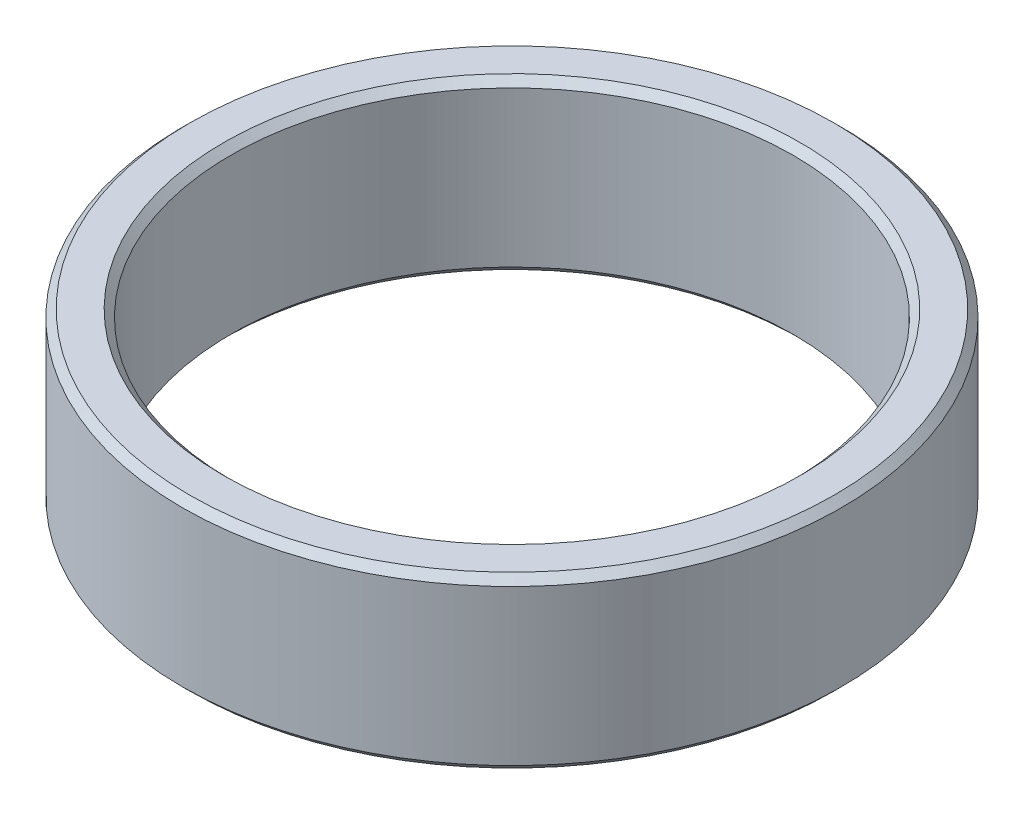
ISO-10303-21;
HEADER;
FILE_DESCRIPTION(('STEP AP214'),'2;1');
FILE_NAME('part.step','',(''),(''),'','','');
FILE_SCHEMA(('AUTOMOTIVE_DESIGN { 1 0 10303 214 1 1 1 1 }'));
ENDSEC;
DATA;
#1=APPLICATION_CONTEXT('core data for automotive mechanical design processes');
#2=APPLICATION_PROTOCOL_DEFINITION('international standard','automotive_design',2000,#1);
#3=PRODUCT_CONTEXT('',#1,'mechanical');
#4=PRODUCT('Part','Part','',(#3));
#5=PRODUCT_RELATED_PRODUCT_CATEGORY('part','',(#4));
#6=PRODUCT_DEFINITION_FORMATION('','',#4);
#7=PRODUCT_DEFINITION_CONTEXT('part definition',#1,'design');
#8=PRODUCT_DEFINITION('design','',#6,#7);
#9=PRODUCT_DEFINITION_SHAPE('','',#8);
#10=(LENGTH_UNIT() NAMED_UNIT(*) SI_UNIT(.MILLI.,.METRE.));
#11=(NAMED_UNIT(*) PLANE_ANGLE_UNIT() SI_UNIT($,.RADIAN.));
#12=(NAMED_UNIT(*) SI_UNIT($,.STERADIAN.) SOLID_ANGLE_UNIT());
#13=UNCERTAINTY_MEASURE_WITH_UNIT(LENGTH_MEASURE(1.E-05),#10,'distance_accuracy_value','');
#14=(GEOMETRIC_REPRESENTATION_CONTEXT(3) GLOBAL_UNCERTAINTY_ASSIGNED_CONTEXT((#13)) GLOBAL_UNIT_ASSIGNED_CONTEXT((#10,
#11,#12)) REPRESENTATION_CONTEXT('',''));
#15=CARTESIAN_POINT('',(0.,0.,0.));
#16=DIRECTION('',(0.,0.,1.));
#17=DIRECTION('',(1.,0.,0.));
#18=AXIS2_PLACEMENT_3D('',#15,#16,#17);
#19=CARTESIAN_POINT('',(0.,7.,0.));
#20=DIRECTION('',(0.,1.,0.));
#21=DIRECTION('',(0.,0.,1.));
#22=AXIS2_PLACEMENT_3D('',#19,#20,#21);
#23=PLANE('',#22);
#24=CARTESIAN_POINT('',(0.,7.,0.));
#25=DIRECTION('',(0.,1.,0.));
#26=DIRECTION('',(0.,0.,1.));
#27=AXIS2_PLACEMENT_3D('',#24,#25,#26);
#28=CIRCLE('',#27,11.9);
#29=CARTESIAN_POINT('',(0.,7.,11.9));
#30=VERTEX_POINT('',#29);
#31=EDGE_CURVE('E10',#30,#30,#28,.F.);
#32=ORIENTED_EDGE('',*,*,#31,.T.);
#33=EDGE_LOOP('',(#32));
#34=FACE_BOUND('',#33,.T.);
#35=CARTESIAN_POINT('',(0.,7.,0.));
#36=DIRECTION('',(0.,1.,0.));
#37=DIRECTION('',(0.,0.,1.));
#38=AXIS2_PLACEMENT_3D('',#35,#36,#37);
#39=CIRCLE('',#38,13.3);
#40=CARTESIAN_POINT('',(0.,7.,13.3));
#41=VERTEX_POINT('',#40);
#42=EDGE_CURVE('E42',#41,#41,#39,.T.);
#43=ORIENTED_EDGE('',*,*,#42,.T.);
#44=EDGE_LOOP('',(#43));
#45=FACE_BOUND('',#44,.T.);
#46=ADVANCED_FACE('F40',(#34,#45),#23,.T.);
#47=CARTESIAN_POINT('',(0.,0.,0.));
#48=DIRECTION('',(0.,1.,0.));
#49=DIRECTION('',(0.,0.,1.));
#50=AXIS2_PLACEMENT_3D('',#47,#48,#49);
#51=PLANE('',#50);
#52=CARTESIAN_POINT('',(0.,0.,0.));
#53=DIRECTION('',(0.,1.,0.));
#54=DIRECTION('',(0.,0.,1.));
#55=AXIS2_PLACEMENT_3D('',#52,#53,#54);
#56=CIRCLE('',#55,11.9);
#57=CARTESIAN_POINT('',(0.,0.,11.9));
#58=VERTEX_POINT('',#57);
#59=EDGE_CURVE('E64',#58,#58,#56,.T.);
#60=ORIENTED_EDGE('',*,*,#59,.T.);
#61=EDGE_LOOP('',(#60));
#62=FACE_BOUND('',#61,.T.);
#63=CARTESIAN_POINT('',(0.,0.,0.));
#64=DIRECTION('',(0.,1.,0.));
#65=DIRECTION('',(0.,0.,1.));
#66=AXIS2_PLACEMENT_3D('',#63,#64,#65);
#67=CIRCLE('',#66,13.3);
#68=CARTESIAN_POINT('',(0.,0.,13.3));
#69=VERTEX_POINT('',#68);
#70=EDGE_CURVE('E67',#69,#69,#67,.F.);
#71=ORIENTED_EDGE('',*,*,#70,.T.);
#72=EDGE_LOOP('',(#71));
#73=FACE_BOUND('',#72,.T.);
#74=ADVANCED_FACE('F66',(#62,#73),#51,.F.);
#75=CARTESIAN_POINT('',(0.,7.,0.));
#76=DIRECTION('',(0.,-1.,0.));
#77=DIRECTION('',(0.,0.,-1.));
#78=AXIS2_PLACEMENT_3D('',#75,#76,#77);
#79=CYLINDRICAL_SURFACE('',#78,13.6);
#80=CARTESIAN_POINT('',(0.,0.299999999999996,0.));
#81=DIRECTION('',(0.,1.,0.));
#82=DIRECTION('',(0.,0.,1.));
#83=AXIS2_PLACEMENT_3D('',#80,#81,#82);
#84=CIRCLE('',#83,13.6);
#85=CARTESIAN_POINT('',(0.,0.299999999999996,13.6));
#86=VERTEX_POINT('',#85);
#87=EDGE_CURVE('E48',#86,#86,#84,.T.);
#88=ORIENTED_EDGE('',*,*,#87,.T.);
#89=EDGE_LOOP('',(#88));
#90=FACE_BOUND('',#89,.T.);
#91=CARTESIAN_POINT('',(0.,6.7,0.));
#92=DIRECTION('',(0.,1.,0.));
#93=DIRECTION('',(0.,0.,1.));
#94=AXIS2_PLACEMENT_3D('',#91,#92,#93);
#95=CIRCLE('',#94,13.6);
#96=CARTESIAN_POINT('',(0.,6.7,13.6));
#97=VERTEX_POINT('',#96);
#98=EDGE_CURVE('E55',#97,#97,#95,.F.);
#99=ORIENTED_EDGE('',*,*,#98,.T.);
#100=EDGE_LOOP('',(#99));
#101=FACE_BOUND('',#100,.T.);
#102=ADVANCED_FACE('F80',(#90,#101),#79,.T.);
#103=CARTESIAN_POINT('',(0.,7.,0.));
#104=DIRECTION('',(0.,-1.,0.));
#105=DIRECTION('',(0.,0.,-1.));
#106=AXIS2_PLACEMENT_3D('',#103,#104,#105);
#107=CYLINDRICAL_SURFACE('',#106,11.6);
#108=CARTESIAN_POINT('',(0.,0.300000000000012,0.));
#109=DIRECTION('',(0.,1.,0.));
#110=DIRECTION('',(0.,0.,1.));
#111=AXIS2_PLACEMENT_3D('',#108,#109,#110);
#112=CIRCLE('',#111,11.6);
#113=CARTESIAN_POINT('',(0.,0.300000000000012,11.6));
#114=VERTEX_POINT('',#113);
#115=EDGE_CURVE('E60',#114,#114,#112,.F.);
#116=ORIENTED_EDGE('',*,*,#115,.T.);
#117=EDGE_LOOP('',(#116));
#118=FACE_BOUND('',#117,.T.);
#119=CARTESIAN_POINT('',(0.,6.7,0.));
#120=DIRECTION('',(0.,1.,0.));
#121=DIRECTION('',(0.,0.,1.));
#122=AXIS2_PLACEMENT_3D('',#119,#120,#121);
#123=CIRCLE('',#122,11.6);
#124=CARTESIAN_POINT('',(0.,6.7,11.6));
#125=VERTEX_POINT('',#124);
#126=EDGE_CURVE('E58',#125,#125,#123,.T.);
#127=ORIENTED_EDGE('',*,*,#126,.T.);
#128=EDGE_LOOP('',(#127));
#129=FACE_BOUND('',#128,.T.);
#130=ADVANCED_FACE('F83',(#118,#129),#107,.F.);
#131=CARTESIAN_POINT('',(0.,0.,0.));
#132=DIRECTION('',(0.,-1.,0.));
#133=DIRECTION('',(0.,0.,-1.));
#134=AXIS2_PLACEMENT_3D('',#131,#132,#133);
#135=CONICAL_SURFACE('',#134,11.9,0.785398163397437);
#136=ORIENTED_EDGE('',*,*,#115,.F.);
#137=EDGE_LOOP('',(#136));
#138=FACE_BOUND('',#137,.T.);
#139=ORIENTED_EDGE('',*,*,#59,.F.);
#140=EDGE_LOOP('',(#139));
#141=FACE_BOUND('',#140,.T.);
#142=ADVANCED_FACE('F76',(#138,#141),#135,.F.);
#143=CARTESIAN_POINT('',(0.,0.299999999999996,0.));
#144=DIRECTION('',(0.,1.,0.));
#145=DIRECTION('',(0.,0.,1.));
#146=AXIS2_PLACEMENT_3D('',#143,#144,#145);
#147=CONICAL_SURFACE('',#146,13.6,0.785398163397448);
#148=ORIENTED_EDGE('',*,*,#70,.F.);
#149=EDGE_LOOP('',(#148));
#150=FACE_BOUND('',#149,.T.);
#151=ORIENTED_EDGE('',*,*,#87,.F.);
#152=EDGE_LOOP('',(#151));
#153=FACE_BOUND('',#152,.T.);
#154=ADVANCED_FACE('F75',(#150,#153),#147,.T.);
#155=CARTESIAN_POINT('',(0.,6.7,0.));
#156=DIRECTION('',(0.,1.,0.));
#157=DIRECTION('',(0.,0.,1.));
#158=AXIS2_PLACEMENT_3D('',#155,#156,#157);
#159=CONICAL_SURFACE('',#158,11.6,0.78539816339746);
#160=ORIENTED_EDGE('',*,*,#31,.F.);
#161=EDGE_LOOP('',(#160));
#162=FACE_BOUND('',#161,.T.);
#163=ORIENTED_EDGE('',*,*,#126,.F.);
#164=EDGE_LOOP('',(#163));
#165=FACE_BOUND('',#164,.T.);
#166=ADVANCED_FACE('F73',(#162,#165),#159,.F.);
#167=CARTESIAN_POINT('',(0.,7.,0.));
#168=DIRECTION('',(0.,-1.,0.));
#169=DIRECTION('',(0.,0.,-1.));
#170=AXIS2_PLACEMENT_3D('',#167,#168,#169);
#171=CONICAL_SURFACE('',#170,13.3,0.785398163397448);
#172=ORIENTED_EDGE('',*,*,#98,.F.);
#173=EDGE_LOOP('',(#172));
#174=FACE_BOUND('',#173,.T.);
#175=ORIENTED_EDGE('',*,*,#42,.F.);
#176=EDGE_LOOP('',(#175));
#177=FACE_BOUND('',#176,.T.);
#178=ADVANCED_FACE('F39',(#174,#177),#171,.T.);
#179=CLOSED_SHELL('',(#46,#74,#102,#130,#142,#154,#166,#178));
#180=MANIFOLD_SOLID_BREP('B2',#179);
#181=ADVANCED_BREP_SHAPE_REPRESENTATION('',(#18,#180),#14);
#182=SHAPE_DEFINITION_REPRESENTATION(#9,#181);
ENDSEC;
END-ISO-10303-21;
